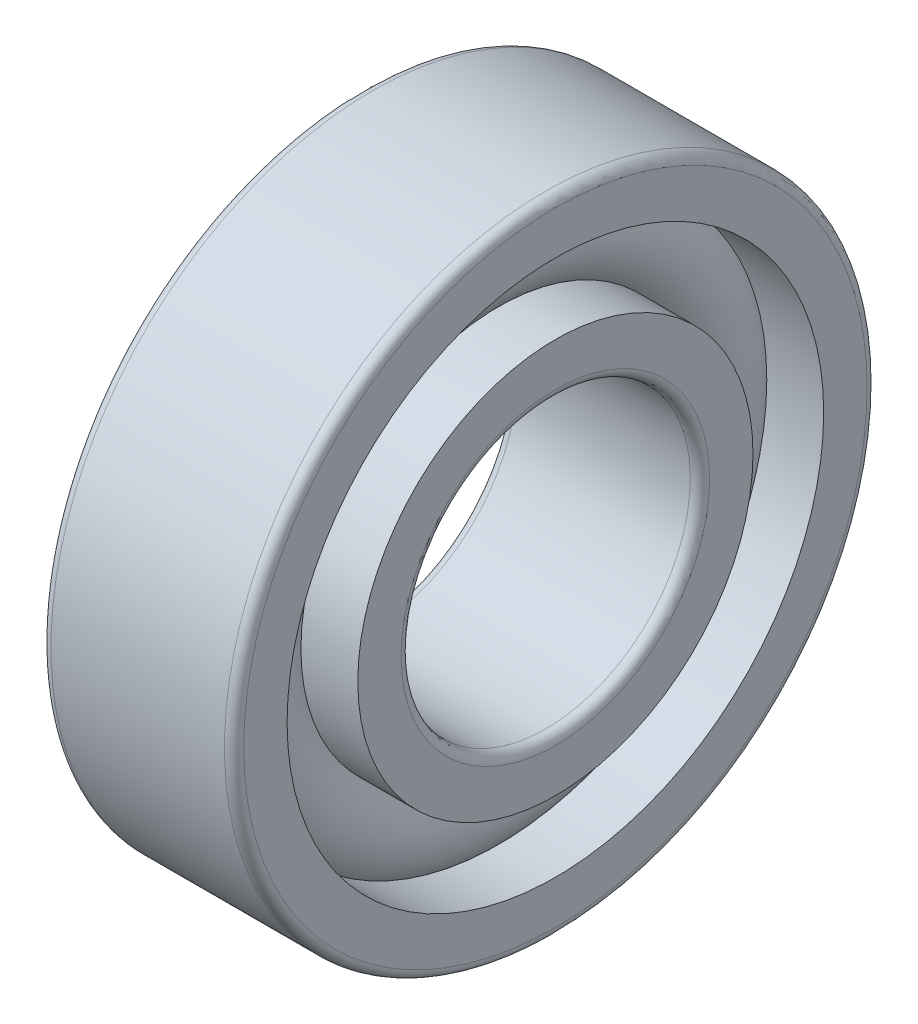
ISO-10303-21;
HEADER;
FILE_DESCRIPTION(('STEP AP214'),'2;1');
FILE_NAME('part.step','',(''),(''),'','','');
FILE_SCHEMA(('AUTOMOTIVE_DESIGN { 1 0 10303 214 1 1 1 1 }'));
ENDSEC;
DATA;
#1=APPLICATION_CONTEXT('core data for automotive mechanical design processes');
#2=APPLICATION_PROTOCOL_DEFINITION('international standard','automotive_design',2000,#1);
#3=PRODUCT_CONTEXT('',#1,'mechanical');
#4=PRODUCT('Part','Part','',(#3));
#5=PRODUCT_RELATED_PRODUCT_CATEGORY('part','',(#4));
#6=PRODUCT_DEFINITION_FORMATION('','',#4);
#7=PRODUCT_DEFINITION_CONTEXT('part definition',#1,'design');
#8=PRODUCT_DEFINITION('design','',#6,#7);
#9=PRODUCT_DEFINITION_SHAPE('','',#8);
#10=(LENGTH_UNIT() NAMED_UNIT(*) SI_UNIT(.MILLI.,.METRE.));
#11=(NAMED_UNIT(*) PLANE_ANGLE_UNIT() SI_UNIT($,.RADIAN.));
#12=(NAMED_UNIT(*) SI_UNIT($,.STERADIAN.) SOLID_ANGLE_UNIT());
#13=UNCERTAINTY_MEASURE_WITH_UNIT(LENGTH_MEASURE(1.E-05),#10,'distance_accuracy_value','');
#14=(GEOMETRIC_REPRESENTATION_CONTEXT(3) GLOBAL_UNCERTAINTY_ASSIGNED_CONTEXT((#13)) GLOBAL_UNIT_ASSIGNED_CONTEXT((#10,
#11,#12)) REPRESENTATION_CONTEXT('',''));
#15=CARTESIAN_POINT('',(0.,0.,0.));
#16=DIRECTION('',(0.,0.,1.));
#17=DIRECTION('',(1.,0.,0.));
#18=AXIS2_PLACEMENT_3D('',#15,#16,#17);
#19=CARTESIAN_POINT('',(0.,0.,0.));
#20=DIRECTION('',(-1.,0.,0.));
#21=DIRECTION('',(0.,0.,1.));
#22=AXIS2_PLACEMENT_3D('',#19,#20,#21);
#23=TOROIDAL_SURFACE('',#22,7.25,1.65);
#24=CARTESIAN_POINT('',(1.22983738762488,0.,0.));
#25=DIRECTION('',(-1.,0.,0.));
#26=DIRECTION('',(0.,0.,1.));
#27=AXIS2_PLACEMENT_3D('',#24,#25,#26);
#28=CIRCLE('',#27,8.35000000000001);
#29=CARTESIAN_POINT('',(1.22983738762488,0.,8.35000000000001));
#30=VERTEX_POINT('',#29);
#31=EDGE_CURVE('E36',#30,#30,#28,.F.);
#32=ORIENTED_EDGE('',*,*,#31,.T.);
#33=EDGE_LOOP('',(#32));
#34=FACE_BOUND('',#33,.T.);
#35=CARTESIAN_POINT('',(1.22983738762488,0.,0.));
#36=DIRECTION('',(-1.,0.,0.));
#37=DIRECTION('',(0.,0.,1.));
#38=AXIS2_PLACEMENT_3D('',#35,#36,#37);
#39=CIRCLE('',#38,6.15);
#40=CARTESIAN_POINT('',(1.22983738762488,0.,6.15));
#41=VERTEX_POINT('',#40);
#42=EDGE_CURVE('E10',#41,#41,#39,.T.);
#43=ORIENTED_EDGE('',*,*,#42,.T.);
#44=EDGE_LOOP('',(#43));
#45=FACE_BOUND('',#44,.T.);
#46=ADVANCED_FACE('F32',(#34,#45),#23,.T.);
#47=CARTESIAN_POINT('',(-20.6375,0.,0.));
#48=DIRECTION('',(1.,0.,0.));
#49=DIRECTION('',(0.,0.,-1.));
#50=AXIS2_PLACEMENT_3D('',#47,#48,#49);
#51=CYLINDRICAL_SURFACE('',#50,6.15);
#52=CARTESIAN_POINT('',(3.,0.,0.));
#53=DIRECTION('',(1.,0.,0.));
#54=DIRECTION('',(0.,0.,-1.));
#55=AXIS2_PLACEMENT_3D('',#52,#53,#54);
#56=CIRCLE('',#55,6.15);
#57=CARTESIAN_POINT('',(3.,0.,-6.15));
#58=VERTEX_POINT('',#57);
#59=EDGE_CURVE('E45',#58,#58,#56,.T.);
#60=ORIENTED_EDGE('',*,*,#59,.F.);
#61=EDGE_LOOP('',(#60));
#62=FACE_BOUND('',#61,.T.);
#63=ORIENTED_EDGE('',*,*,#42,.F.);
#64=EDGE_LOOP('',(#63));
#65=FACE_BOUND('',#64,.T.);
#66=ADVANCED_FACE('F84',(#62,#65),#51,.T.);
#67=CARTESIAN_POINT('',(-20.6375,0.,0.));
#68=DIRECTION('',(1.,0.,0.));
#69=DIRECTION('',(0.,0.,-1.));
#70=AXIS2_PLACEMENT_3D('',#67,#68,#69);
#71=CYLINDRICAL_SURFACE('',#70,6.15);
#72=CARTESIAN_POINT('',(-3.,0.,0.));
#73=DIRECTION('',(1.,0.,0.));
#74=DIRECTION('',(0.,0.,-1.));
#75=AXIS2_PLACEMENT_3D('',#72,#73,#74);
#76=CIRCLE('',#75,6.15);
#77=CARTESIAN_POINT('',(-3.,0.,-6.15));
#78=VERTEX_POINT('',#77);
#79=EDGE_CURVE('E54',#78,#78,#76,.T.);
#80=ORIENTED_EDGE('',*,*,#79,.T.);
#81=EDGE_LOOP('',(#80));
#82=FACE_BOUND('',#81,.T.);
#83=CARTESIAN_POINT('',(-1.22983738762488,0.,0.));
#84=DIRECTION('',(1.,0.,0.));
#85=DIRECTION('',(0.,0.,-1.));
#86=AXIS2_PLACEMENT_3D('',#83,#84,#85);
#87=CIRCLE('',#86,6.15);
#88=CARTESIAN_POINT('',(-1.22983738762488,0.,-6.15));
#89=VERTEX_POINT('',#88);
#90=EDGE_CURVE('E40',#89,#89,#87,.T.);
#91=ORIENTED_EDGE('',*,*,#90,.F.);
#92=EDGE_LOOP('',(#91));
#93=FACE_BOUND('',#92,.T.);
#94=ADVANCED_FACE('F87',(#82,#93),#71,.T.);
#95=CARTESIAN_POINT('',(3.,4.8,0.));
#96=DIRECTION('',(1.,0.,0.));
#97=DIRECTION('',(0.,0.,-1.));
#98=AXIS2_PLACEMENT_3D('',#95,#96,#97);
#99=PLANE('',#98);
#100=ORIENTED_EDGE('',*,*,#59,.T.);
#101=EDGE_LOOP('',(#100));
#102=FACE_BOUND('',#101,.T.);
#103=CARTESIAN_POINT('',(3.,0.,0.));
#104=DIRECTION('',(1.,0.,0.));
#105=DIRECTION('',(0.,0.,-1.));
#106=AXIS2_PLACEMENT_3D('',#103,#104,#105);
#107=CIRCLE('',#106,4.8);
#108=CARTESIAN_POINT('',(3.,0.,-4.8));
#109=VERTEX_POINT('',#108);
#110=EDGE_CURVE('E76',#109,#109,#107,.T.);
#111=ORIENTED_EDGE('',*,*,#110,.F.);
#112=EDGE_LOOP('',(#111));
#113=FACE_BOUND('',#112,.T.);
#114=ADVANCED_FACE('F81',(#102,#113),#99,.T.);
#115=CARTESIAN_POINT('',(2.7,0.,0.));
#116=DIRECTION('',(1.,0.,0.));
#117=DIRECTION('',(0.,0.,-1.));
#118=AXIS2_PLACEMENT_3D('',#115,#116,#117);
#119=TOROIDAL_SURFACE('',#118,4.8,0.3);
#120=ORIENTED_EDGE('',*,*,#110,.T.);
#121=EDGE_LOOP('',(#120));
#122=FACE_BOUND('',#121,.T.);
#123=CARTESIAN_POINT('',(2.7,0.,0.));
#124=DIRECTION('',(1.,0.,0.));
#125=DIRECTION('',(0.,0.,-1.));
#126=AXIS2_PLACEMENT_3D('',#123,#124,#125);
#127=CIRCLE('',#126,4.5);
#128=CARTESIAN_POINT('',(2.7,0.,-4.5));
#129=VERTEX_POINT('',#128);
#130=EDGE_CURVE('E73',#129,#129,#127,.T.);
#131=ORIENTED_EDGE('',*,*,#130,.F.);
#132=EDGE_LOOP('',(#131));
#133=FACE_BOUND('',#132,.T.);
#134=ADVANCED_FACE('F98',(#122,#133),#119,.T.);
#135=CARTESIAN_POINT('',(-20.6375,0.,0.));
#136=DIRECTION('',(1.,0.,0.));
#137=DIRECTION('',(0.,0.,-1.));
#138=AXIS2_PLACEMENT_3D('',#135,#136,#137);
#139=CYLINDRICAL_SURFACE('',#138,4.5);
#140=ORIENTED_EDGE('',*,*,#130,.T.);
#141=EDGE_LOOP('',(#140));
#142=FACE_BOUND('',#141,.T.);
#143=CARTESIAN_POINT('',(-2.7,0.,0.));
#144=DIRECTION('',(1.,0.,0.));
#145=DIRECTION('',(0.,0.,-1.));
#146=AXIS2_PLACEMENT_3D('',#143,#144,#145);
#147=CIRCLE('',#146,4.5);
#148=CARTESIAN_POINT('',(-2.7,0.,-4.5));
#149=VERTEX_POINT('',#148);
#150=EDGE_CURVE('E70',#149,#149,#147,.T.);
#151=ORIENTED_EDGE('',*,*,#150,.F.);
#152=EDGE_LOOP('',(#151));
#153=FACE_BOUND('',#152,.T.);
#154=ADVANCED_FACE('F101',(#142,#153),#139,.F.);
#155=CARTESIAN_POINT('',(-2.7,0.,0.));
#156=DIRECTION('',(1.,0.,0.));
#157=DIRECTION('',(0.,0.,-1.));
#158=AXIS2_PLACEMENT_3D('',#155,#156,#157);
#159=TOROIDAL_SURFACE('',#158,4.8,0.3);
#160=ORIENTED_EDGE('',*,*,#150,.T.);
#161=EDGE_LOOP('',(#160));
#162=FACE_BOUND('',#161,.T.);
#163=CARTESIAN_POINT('',(-3.,0.,0.));
#164=DIRECTION('',(1.,0.,0.));
#165=DIRECTION('',(0.,0.,-1.));
#166=AXIS2_PLACEMENT_3D('',#163,#164,#165);
#167=CIRCLE('',#166,4.8);
#168=CARTESIAN_POINT('',(-3.,0.,-4.8));
#169=VERTEX_POINT('',#168);
#170=EDGE_CURVE('E67',#169,#169,#167,.T.);
#171=ORIENTED_EDGE('',*,*,#170,.F.);
#172=EDGE_LOOP('',(#171));
#173=FACE_BOUND('',#172,.T.);
#174=ADVANCED_FACE('F105',(#162,#173),#159,.T.);
#175=CARTESIAN_POINT('',(-3.,6.15,0.));
#176=DIRECTION('',(-1.,0.,0.));
#177=DIRECTION('',(0.,0.,1.));
#178=AXIS2_PLACEMENT_3D('',#175,#176,#177);
#179=PLANE('',#178);
#180=ORIENTED_EDGE('',*,*,#170,.T.);
#181=EDGE_LOOP('',(#180));
#182=FACE_BOUND('',#181,.T.);
#183=ORIENTED_EDGE('',*,*,#79,.F.);
#184=EDGE_LOOP('',(#183));
#185=FACE_BOUND('',#184,.T.);
#186=ADVANCED_FACE('F109',(#182,#185),#179,.T.);
#187=CARTESIAN_POINT('',(-1.22983738762488,0.,0.));
#188=DIRECTION('',(1.,0.,0.));
#189=DIRECTION('',(0.,0.,-1.));
#190=AXIS2_PLACEMENT_3D('',#187,#188,#189);
#191=CIRCLE('',#190,8.35000000000001);
#192=CARTESIAN_POINT('',(-1.22983738762488,0.,-8.35000000000001));
#193=VERTEX_POINT('',#192);
#194=EDGE_CURVE('E48',#193,#193,#191,.F.);
#195=ORIENTED_EDGE('',*,*,#194,.T.);
#196=EDGE_LOOP('',(#195));
#197=FACE_BOUND('',#196,.T.);
#198=ORIENTED_EDGE('',*,*,#90,.T.);
#199=EDGE_LOOP('',(#198));
#200=FACE_BOUND('',#199,.T.);
#201=ADVANCED_FACE('F34',(#197,#200),#23,.T.);
#202=CARTESIAN_POINT('',(-20.6375,0.,0.));
#203=DIRECTION('',(1.,0.,0.));
#204=DIRECTION('',(0.,0.,-1.));
#205=AXIS2_PLACEMENT_3D('',#202,#203,#204);
#206=CYLINDRICAL_SURFACE('',#205,8.35000000000001);
#207=CARTESIAN_POINT('',(3.,0.,0.));
#208=DIRECTION('',(1.,0.,0.));
#209=DIRECTION('',(0.,0.,-1.));
#210=AXIS2_PLACEMENT_3D('',#207,#208,#209);
#211=CIRCLE('',#210,8.35);
#212=CARTESIAN_POINT('',(3.,0.,-8.35));
#213=VERTEX_POINT('',#212);
#214=EDGE_CURVE('E50',#213,#213,#211,.T.);
#215=ORIENTED_EDGE('',*,*,#214,.T.);
#216=EDGE_LOOP('',(#215));
#217=FACE_BOUND('',#216,.T.);
#218=ORIENTED_EDGE('',*,*,#31,.F.);
#219=EDGE_LOOP('',(#218));
#220=FACE_BOUND('',#219,.T.);
#221=ADVANCED_FACE('F114',(#217,#220),#206,.F.);
#222=CARTESIAN_POINT('',(-20.6375,0.,0.));
#223=DIRECTION('',(1.,0.,0.));
#224=DIRECTION('',(0.,0.,-1.));
#225=AXIS2_PLACEMENT_3D('',#222,#223,#224);
#226=CYLINDRICAL_SURFACE('',#225,8.35000000000001);
#227=CARTESIAN_POINT('',(-3.,0.,0.));
#228=DIRECTION('',(1.,0.,0.));
#229=DIRECTION('',(0.,0.,-1.));
#230=AXIS2_PLACEMENT_3D('',#227,#228,#229);
#231=CIRCLE('',#230,8.35);
#232=CARTESIAN_POINT('',(-3.,0.,-8.35));
#233=VERTEX_POINT('',#232);
#234=EDGE_CURVE('E145',#233,#233,#231,.T.);
#235=ORIENTED_EDGE('',*,*,#234,.F.);
#236=EDGE_LOOP('',(#235));
#237=FACE_BOUND('',#236,.T.);
#238=ORIENTED_EDGE('',*,*,#194,.F.);
#239=EDGE_LOOP('',(#238));
#240=FACE_BOUND('',#239,.T.);
#241=ADVANCED_FACE('F117',(#237,#240),#226,.F.);
#242=CARTESIAN_POINT('',(3.,9.7,0.));
#243=DIRECTION('',(1.,0.,0.));
#244=DIRECTION('',(0.,0.,-1.));
#245=AXIS2_PLACEMENT_3D('',#242,#243,#244);
#246=PLANE('',#245);
#247=CARTESIAN_POINT('',(3.,0.,0.));
#248=DIRECTION('',(1.,0.,0.));
#249=DIRECTION('',(0.,0.,-1.));
#250=AXIS2_PLACEMENT_3D('',#247,#248,#249);
#251=CIRCLE('',#250,9.7);
#252=CARTESIAN_POINT('',(3.,0.,-9.7));
#253=VERTEX_POINT('',#252);
#254=EDGE_CURVE('E56',#253,#253,#251,.T.);
#255=ORIENTED_EDGE('',*,*,#254,.T.);
#256=EDGE_LOOP('',(#255));
#257=FACE_BOUND('',#256,.T.);
#258=ORIENTED_EDGE('',*,*,#214,.F.);
#259=EDGE_LOOP('',(#258));
#260=FACE_BOUND('',#259,.T.);
#261=ADVANCED_FACE('F118',(#257,#260),#246,.T.);
#262=CARTESIAN_POINT('',(2.7,0.,0.));
#263=DIRECTION('',(1.,0.,0.));
#264=DIRECTION('',(0.,0.,-1.));
#265=AXIS2_PLACEMENT_3D('',#262,#263,#264);
#266=TOROIDAL_SURFACE('',#265,9.7,0.3);
#267=CARTESIAN_POINT('',(2.7,0.,0.));
#268=DIRECTION('',(1.,0.,0.));
#269=DIRECTION('',(0.,0.,-1.));
#270=AXIS2_PLACEMENT_3D('',#267,#268,#269);
#271=CIRCLE('',#270,10.);
#272=CARTESIAN_POINT('',(2.7,0.,-10.));
#273=VERTEX_POINT('',#272);
#274=EDGE_CURVE('E61',#273,#273,#271,.T.);
#275=ORIENTED_EDGE('',*,*,#274,.T.);
#276=EDGE_LOOP('',(#275));
#277=FACE_BOUND('',#276,.T.);
#278=ORIENTED_EDGE('',*,*,#254,.F.);
#279=EDGE_LOOP('',(#278));
#280=FACE_BOUND('',#279,.T.);
#281=ADVANCED_FACE('F121',(#277,#280),#266,.T.);
#282=CARTESIAN_POINT('',(-20.6375,0.,0.));
#283=DIRECTION('',(1.,0.,0.));
#284=DIRECTION('',(0.,0.,-1.));
#285=AXIS2_PLACEMENT_3D('',#282,#283,#284);
#286=CYLINDRICAL_SURFACE('',#285,10.);
#287=CARTESIAN_POINT('',(-2.7,0.,0.));
#288=DIRECTION('',(1.,0.,0.));
#289=DIRECTION('',(0.,0.,-1.));
#290=AXIS2_PLACEMENT_3D('',#287,#288,#289);
#291=CIRCLE('',#290,10.);
#292=CARTESIAN_POINT('',(-2.7,0.,-10.));
#293=VERTEX_POINT('',#292);
#294=EDGE_CURVE('E149',#293,#293,#291,.T.);
#295=ORIENTED_EDGE('',*,*,#294,.T.);
#296=EDGE_LOOP('',(#295));
#297=FACE_BOUND('',#296,.T.);
#298=ORIENTED_EDGE('',*,*,#274,.F.);
#299=EDGE_LOOP('',(#298));
#300=FACE_BOUND('',#299,.T.);
#301=ADVANCED_FACE('F125',(#297,#300),#286,.T.);
#302=CARTESIAN_POINT('',(-2.7,0.,0.));
#303=DIRECTION('',(1.,0.,0.));
#304=DIRECTION('',(0.,0.,-1.));
#305=AXIS2_PLACEMENT_3D('',#302,#303,#304);
#306=TOROIDAL_SURFACE('',#305,9.7,0.3);
#307=CARTESIAN_POINT('',(-3.,0.,0.));
#308=DIRECTION('',(1.,0.,0.));
#309=DIRECTION('',(0.,0.,-1.));
#310=AXIS2_PLACEMENT_3D('',#307,#308,#309);
#311=CIRCLE('',#310,9.7);
#312=CARTESIAN_POINT('',(-3.,0.,-9.7));
#313=VERTEX_POINT('',#312);
#314=EDGE_CURVE('E146',#313,#313,#311,.T.);
#315=ORIENTED_EDGE('',*,*,#314,.T.);
#316=EDGE_LOOP('',(#315));
#317=FACE_BOUND('',#316,.T.);
#318=ORIENTED_EDGE('',*,*,#294,.F.);
#319=EDGE_LOOP('',(#318));
#320=FACE_BOUND('',#319,.T.);
#321=ADVANCED_FACE('F129',(#317,#320),#306,.T.);
#322=CARTESIAN_POINT('',(-3.,8.35,0.));
#323=DIRECTION('',(-1.,0.,0.));
#324=DIRECTION('',(0.,0.,1.));
#325=AXIS2_PLACEMENT_3D('',#322,#323,#324);
#326=PLANE('',#325);
#327=ORIENTED_EDGE('',*,*,#234,.T.);
#328=EDGE_LOOP('',(#327));
#329=FACE_BOUND('',#328,.T.);
#330=ORIENTED_EDGE('',*,*,#314,.F.);
#331=EDGE_LOOP('',(#330));
#332=FACE_BOUND('',#331,.T.);
#333=ADVANCED_FACE('F133',(#329,#332),#326,.T.);
#334=CLOSED_SHELL('',(#46,#66,#94,#114,#134,#154,#174,#186,#201,#221,#241,#261,#281,#301,#321,#333));
#335=MANIFOLD_SOLID_BREP('B2',#334);
#336=ADVANCED_BREP_SHAPE_REPRESENTATION('',(#18,#335),#14);
#337=SHAPE_DEFINITION_REPRESENTATION(#9,#336);
ENDSEC;
END-ISO-10303-21;
